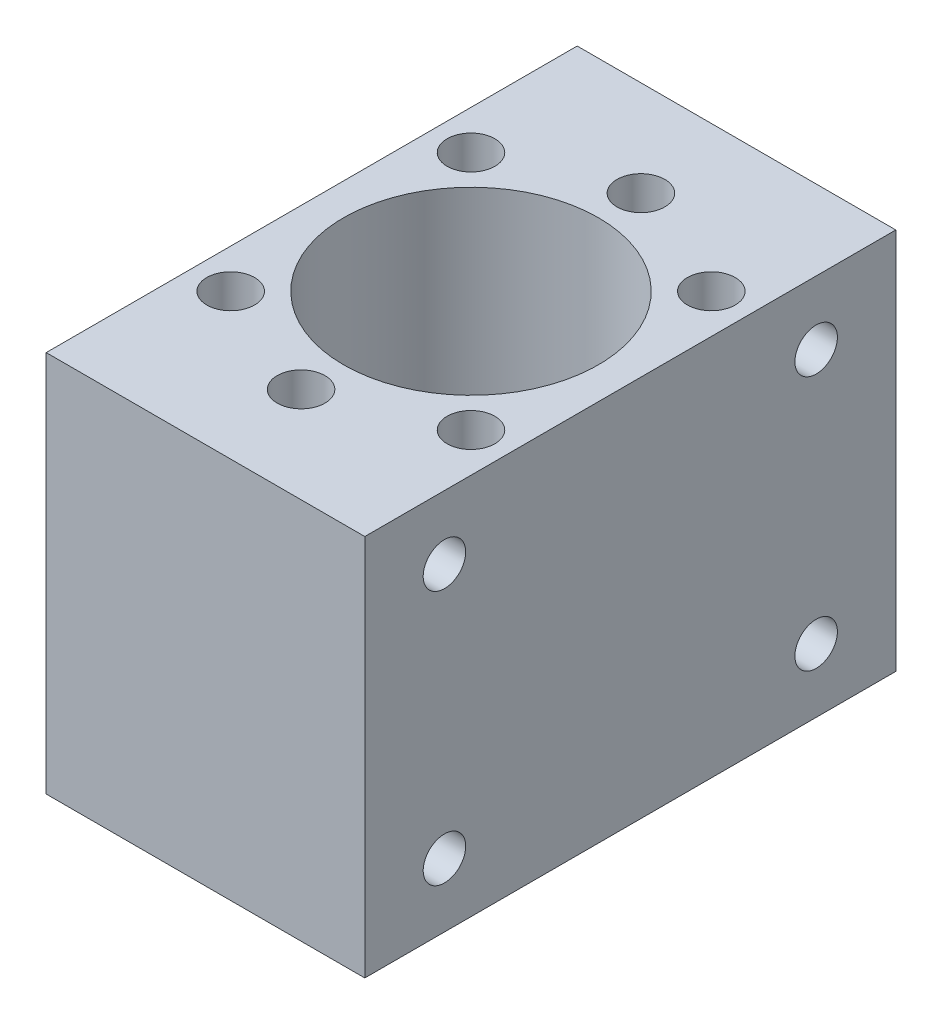
ISO-10303-21;
HEADER;
FILE_DESCRIPTION(('STEP AP214'),'2;1');
FILE_NAME('part.step','',(''),(''),'','','');
FILE_SCHEMA(('AUTOMOTIVE_DESIGN { 1 0 10303 214 1 1 1 1 }'));
ENDSEC;
DATA;
#1=APPLICATION_CONTEXT('core data for automotive mechanical design processes');
#2=APPLICATION_PROTOCOL_DEFINITION('international standard','automotive_design',2000,#1);
#3=PRODUCT_CONTEXT('',#1,'mechanical');
#4=PRODUCT('Part','Part','',(#3));
#5=PRODUCT_RELATED_PRODUCT_CATEGORY('part','',(#4));
#6=PRODUCT_DEFINITION_FORMATION('','',#4);
#7=PRODUCT_DEFINITION_CONTEXT('part definition',#1,'design');
#8=PRODUCT_DEFINITION('design','',#6,#7);
#9=PRODUCT_DEFINITION_SHAPE('','',#8);
#10=(LENGTH_UNIT() NAMED_UNIT(*) SI_UNIT(.MILLI.,.METRE.));
#11=(NAMED_UNIT(*) PLANE_ANGLE_UNIT() SI_UNIT($,.RADIAN.));
#12=(NAMED_UNIT(*) SI_UNIT($,.STERADIAN.) SOLID_ANGLE_UNIT());
#13=UNCERTAINTY_MEASURE_WITH_UNIT(LENGTH_MEASURE(1.E-05),#10,'distance_accuracy_value','');
#14=(GEOMETRIC_REPRESENTATION_CONTEXT(3) GLOBAL_UNCERTAINTY_ASSIGNED_CONTEXT((#13)) GLOBAL_UNIT_ASSIGNED_CONTEXT((#10,
#11,#12)) REPRESENTATION_CONTEXT('',''));
#15=CARTESIAN_POINT('',(0.,0.,0.));
#16=DIRECTION('',(0.,0.,1.));
#17=DIRECTION('',(1.,0.,0.));
#18=AXIS2_PLACEMENT_3D('',#15,#16,#17);
#19=CARTESIAN_POINT('',(-15.,4.,-25.));
#20=DIRECTION('',(0.,0.,-1.));
#21=DIRECTION('',(-1.,0.,0.));
#22=AXIS2_PLACEMENT_3D('',#19,#20,#21);
#23=PLANE('',#22);
#24=DIRECTION('',(-1.,0.,0.));
#25=VECTOR('',#24,1.);
#26=CARTESIAN_POINT('',(-15.,40.,-25.));
#27=LINE('',#26,#25);
#28=CARTESIAN_POINT('',(15.,40.,-25.));
#29=VERTEX_POINT('',#28);
#30=CARTESIAN_POINT('',(-15.,40.,-25.));
#31=VERTEX_POINT('',#30);
#32=EDGE_CURVE('E113',#29,#31,#27,.T.);
#33=ORIENTED_EDGE('',*,*,#32,.F.);
#34=DIRECTION('',(0.,1.,0.));
#35=VECTOR('',#34,1.);
#36=CARTESIAN_POINT('',(15.,4.,-25.));
#37=LINE('',#36,#35);
#38=CARTESIAN_POINT('',(15.,4.,-25.));
#39=VERTEX_POINT('',#38);
#40=EDGE_CURVE('E88',#39,#29,#37,.T.);
#41=ORIENTED_EDGE('',*,*,#40,.F.);
#42=DIRECTION('',(-1.,0.,0.));
#43=VECTOR('',#42,1.);
#44=CARTESIAN_POINT('',(-15.,4.,-25.));
#45=LINE('',#44,#43);
#46=CARTESIAN_POINT('',(-15.,4.,-25.));
#47=VERTEX_POINT('',#46);
#48=EDGE_CURVE('E102',#39,#47,#45,.T.);
#49=ORIENTED_EDGE('',*,*,#48,.T.);
#50=DIRECTION('',(0.,1.,0.));
#51=VECTOR('',#50,1.);
#52=CARTESIAN_POINT('',(-15.,4.,-25.));
#53=LINE('',#52,#51);
#54=EDGE_CURVE('E94',#47,#31,#53,.T.);
#55=ORIENTED_EDGE('',*,*,#54,.T.);
#56=EDGE_LOOP('',(#33,#41,#49,#55));
#57=FACE_BOUND('',#56,.T.);
#58=ADVANCED_FACE('F47',(#57),#23,.T.);
#59=CARTESIAN_POINT('',(-15.,4.,25.));
#60=DIRECTION('',(0.,0.,1.));
#61=DIRECTION('',(1.,0.,0.));
#62=AXIS2_PLACEMENT_3D('',#59,#60,#61);
#63=PLANE('',#62);
#64=DIRECTION('',(1.,0.,0.));
#65=VECTOR('',#64,1.);
#66=CARTESIAN_POINT('',(-15.,40.,25.));
#67=LINE('',#66,#65);
#68=CARTESIAN_POINT('',(-15.,40.,25.));
#69=VERTEX_POINT('',#68);
#70=CARTESIAN_POINT('',(15.,40.,25.));
#71=VERTEX_POINT('',#70);
#72=EDGE_CURVE('E108',#69,#71,#67,.T.);
#73=ORIENTED_EDGE('',*,*,#72,.F.);
#74=DIRECTION('',(0.,1.,0.));
#75=VECTOR('',#74,1.);
#76=CARTESIAN_POINT('',(-15.,4.,25.));
#77=LINE('',#76,#75);
#78=CARTESIAN_POINT('',(-15.,4.,25.));
#79=VERTEX_POINT('',#78);
#80=EDGE_CURVE('E98',#79,#69,#77,.T.);
#81=ORIENTED_EDGE('',*,*,#80,.F.);
#82=DIRECTION('',(1.,0.,0.));
#83=VECTOR('',#82,1.);
#84=CARTESIAN_POINT('',(-15.,4.,25.));
#85=LINE('',#84,#83);
#86=CARTESIAN_POINT('',(15.,4.,25.));
#87=VERTEX_POINT('',#86);
#88=EDGE_CURVE('E104',#79,#87,#85,.T.);
#89=ORIENTED_EDGE('',*,*,#88,.T.);
#90=DIRECTION('',(0.,1.,0.));
#91=VECTOR('',#90,1.);
#92=CARTESIAN_POINT('',(15.,4.,25.));
#93=LINE('',#92,#91);
#94=EDGE_CURVE('E64',#87,#71,#93,.T.);
#95=ORIENTED_EDGE('',*,*,#94,.T.);
#96=EDGE_LOOP('',(#73,#81,#89,#95));
#97=FACE_BOUND('',#96,.T.);
#98=ADVANCED_FACE('F144',(#97),#63,.T.);
#99=CARTESIAN_POINT('',(0.,40.,0.));
#100=DIRECTION('',(0.,1.,0.));
#101=DIRECTION('',(0.,0.,1.));
#102=AXIS2_PLACEMENT_3D('',#99,#100,#101);
#103=PLANE('',#102);
#104=CARTESIAN_POINT('',(0.,40.,0.));
#105=DIRECTION('',(0.,1.,0.));
#106=DIRECTION('',(0.,0.,1.));
#107=AXIS2_PLACEMENT_3D('',#104,#105,#106);
#108=CIRCLE('',#107,12.);
#109=CARTESIAN_POINT('',(0.,40.,12.));
#110=VERTEX_POINT('',#109);
#111=EDGE_CURVE('E170',#110,#110,#108,.T.);
#112=ORIENTED_EDGE('',*,*,#111,.F.);
#113=EDGE_LOOP('',(#112));
#114=FACE_BOUND('',#113,.T.);
#115=CARTESIAN_POINT('',(-11.3137084989848,40.,11.3137084989848));
#116=DIRECTION('',(0.,1.,0.));
#117=DIRECTION('',(0.,0.,1.));
#118=AXIS2_PLACEMENT_3D('',#115,#116,#117);
#119=CIRCLE('',#118,2.25);
#120=CARTESIAN_POINT('',(-11.3137084989848,40.,13.5637084989848));
#121=VERTEX_POINT('',#120);
#122=EDGE_CURVE('E123',#121,#121,#119,.T.);
#123=ORIENTED_EDGE('',*,*,#122,.F.);
#124=EDGE_LOOP('',(#123));
#125=FACE_BOUND('',#124,.T.);
#126=CARTESIAN_POINT('',(11.3137084989848,40.,11.3137084989848));
#127=DIRECTION('',(0.,1.,0.));
#128=DIRECTION('',(0.,0.,1.));
#129=AXIS2_PLACEMENT_3D('',#126,#127,#128);
#130=CIRCLE('',#129,2.25);
#131=CARTESIAN_POINT('',(11.3137084989848,40.,13.5637084989848));
#132=VERTEX_POINT('',#131);
#133=EDGE_CURVE('E129',#132,#132,#130,.T.);
#134=ORIENTED_EDGE('',*,*,#133,.F.);
#135=EDGE_LOOP('',(#134));
#136=FACE_BOUND('',#135,.T.);
#137=CARTESIAN_POINT('',(0.,40.,-16.));
#138=DIRECTION('',(0.,1.,0.));
#139=DIRECTION('',(0.,0.,1.));
#140=AXIS2_PLACEMENT_3D('',#137,#138,#139);
#141=CIRCLE('',#140,2.25);
#142=CARTESIAN_POINT('',(0.,40.,-13.75));
#143=VERTEX_POINT('',#142);
#144=EDGE_CURVE('E135',#143,#143,#141,.T.);
#145=ORIENTED_EDGE('',*,*,#144,.F.);
#146=EDGE_LOOP('',(#145));
#147=FACE_BOUND('',#146,.T.);
#148=DIRECTION('',(0.,0.,-1.));
#149=VECTOR('',#148,1.);
#150=CARTESIAN_POINT('',(15.,40.,13.228756555323));
#151=LINE('',#150,#149);
#152=EDGE_CURVE('E11',#71,#29,#151,.T.);
#153=ORIENTED_EDGE('',*,*,#152,.T.);
#154=ORIENTED_EDGE('',*,*,#32,.T.);
#155=DIRECTION('',(0.,0.,1.));
#156=VECTOR('',#155,1.);
#157=CARTESIAN_POINT('',(-15.,40.,-13.228756555323));
#158=LINE('',#157,#156);
#159=EDGE_CURVE('E56',#31,#69,#158,.T.);
#160=ORIENTED_EDGE('',*,*,#159,.T.);
#161=ORIENTED_EDGE('',*,*,#72,.T.);
#162=EDGE_LOOP('',(#153,#154,#160,#161));
#163=FACE_BOUND('',#162,.T.);
#164=CARTESIAN_POINT('',(11.3137084989848,40.,-11.3137084989848));
#165=DIRECTION('',(0.,1.,0.));
#166=DIRECTION('',(0.,0.,1.));
#167=AXIS2_PLACEMENT_3D('',#164,#165,#166);
#168=CIRCLE('',#167,2.25);
#169=CARTESIAN_POINT('',(11.3137084989848,40.,-9.06370849898476));
#170=VERTEX_POINT('',#169);
#171=EDGE_CURVE('E132',#170,#170,#168,.T.);
#172=ORIENTED_EDGE('',*,*,#171,.F.);
#173=EDGE_LOOP('',(#172));
#174=FACE_BOUND('',#173,.T.);
#175=CARTESIAN_POINT('',(0.,40.,16.));
#176=DIRECTION('',(0.,1.,0.));
#177=DIRECTION('',(0.,0.,1.));
#178=AXIS2_PLACEMENT_3D('',#175,#176,#177);
#179=CIRCLE('',#178,2.25);
#180=CARTESIAN_POINT('',(0.,40.,18.25));
#181=VERTEX_POINT('',#180);
#182=EDGE_CURVE('E126',#181,#181,#179,.T.);
#183=ORIENTED_EDGE('',*,*,#182,.F.);
#184=EDGE_LOOP('',(#183));
#185=FACE_BOUND('',#184,.T.);
#186=CARTESIAN_POINT('',(-11.3137084989848,40.,-11.3137084989848));
#187=DIRECTION('',(0.,1.,0.));
#188=DIRECTION('',(0.,0.,1.));
#189=AXIS2_PLACEMENT_3D('',#186,#187,#188);
#190=CIRCLE('',#189,2.25);
#191=CARTESIAN_POINT('',(-11.3137084989848,40.,-9.06370849898476));
#192=VERTEX_POINT('',#191);
#193=EDGE_CURVE('E118',#192,#192,#190,.T.);
#194=ORIENTED_EDGE('',*,*,#193,.F.);
#195=EDGE_LOOP('',(#194));
#196=FACE_BOUND('',#195,.T.);
#197=ADVANCED_FACE('F142',(#114,#125,#136,#147,#163,#174,#185,#196),#103,.T.);
#198=CARTESIAN_POINT('',(-15.,40.,-13.228756555323));
#199=DIRECTION('',(1.,0.,0.));
#200=DIRECTION('',(0.,0.,-1.));
#201=AXIS2_PLACEMENT_3D('',#198,#199,#200);
#202=PLANE('',#201);
#203=ORIENTED_EDGE('',*,*,#159,.F.);
#204=ORIENTED_EDGE('',*,*,#54,.F.);
#205=DIRECTION('',(0.,0.,1.));
#206=VECTOR('',#205,1.);
#207=CARTESIAN_POINT('',(-15.,4.,-25.));
#208=LINE('',#207,#206);
#209=EDGE_CURVE('E96',#47,#79,#208,.T.);
#210=ORIENTED_EDGE('',*,*,#209,.T.);
#211=ORIENTED_EDGE('',*,*,#80,.T.);
#212=EDGE_LOOP('',(#203,#204,#210,#211));
#213=FACE_BOUND('',#212,.T.);
#214=ADVANCED_FACE('F49',(#213),#202,.F.);
#215=CARTESIAN_POINT('',(15.,40.,13.228756555323));
#216=DIRECTION('',(-1.,0.,0.));
#217=DIRECTION('',(0.,0.,1.));
#218=AXIS2_PLACEMENT_3D('',#215,#216,#217);
#219=PLANE('',#218);
#220=CARTESIAN_POINT('',(15.,10.,-17.5));
#221=DIRECTION('',(1.,0.,0.));
#222=DIRECTION('',(0.,0.,-1.));
#223=AXIS2_PLACEMENT_3D('',#220,#221,#222);
#224=CIRCLE('',#223,2.);
#225=CARTESIAN_POINT('',(15.,10.,-19.5));
#226=VERTEX_POINT('',#225);
#227=EDGE_CURVE('E265',#226,#226,#224,.T.);
#228=ORIENTED_EDGE('',*,*,#227,.F.);
#229=EDGE_LOOP('',(#228));
#230=FACE_BOUND('',#229,.T.);
#231=CARTESIAN_POINT('',(15.,10.,17.5));
#232=DIRECTION('',(1.,0.,0.));
#233=DIRECTION('',(0.,0.,-1.));
#234=AXIS2_PLACEMENT_3D('',#231,#232,#233);
#235=CIRCLE('',#234,2.);
#236=CARTESIAN_POINT('',(15.,10.,15.5));
#237=VERTEX_POINT('',#236);
#238=EDGE_CURVE('E257',#237,#237,#235,.T.);
#239=ORIENTED_EDGE('',*,*,#238,.F.);
#240=EDGE_LOOP('',(#239));
#241=FACE_BOUND('',#240,.T.);
#242=CARTESIAN_POINT('',(15.,34.,17.5));
#243=DIRECTION('',(1.,0.,0.));
#244=DIRECTION('',(0.,0.,-1.));
#245=AXIS2_PLACEMENT_3D('',#242,#243,#244);
#246=CIRCLE('',#245,2.);
#247=CARTESIAN_POINT('',(15.,34.,15.5));
#248=VERTEX_POINT('',#247);
#249=EDGE_CURVE('E250',#248,#248,#246,.T.);
#250=ORIENTED_EDGE('',*,*,#249,.F.);
#251=EDGE_LOOP('',(#250));
#252=FACE_BOUND('',#251,.T.);
#253=CARTESIAN_POINT('',(15.,34.,-17.5));
#254=DIRECTION('',(1.,0.,0.));
#255=DIRECTION('',(0.,0.,-1.));
#256=AXIS2_PLACEMENT_3D('',#253,#254,#255);
#257=CIRCLE('',#256,2.);
#258=CARTESIAN_POINT('',(15.,34.,-19.5));
#259=VERTEX_POINT('',#258);
#260=EDGE_CURVE('E252',#259,#259,#257,.T.);
#261=ORIENTED_EDGE('',*,*,#260,.F.);
#262=EDGE_LOOP('',(#261));
#263=FACE_BOUND('',#262,.T.);
#264=ORIENTED_EDGE('',*,*,#40,.T.);
#265=ORIENTED_EDGE('',*,*,#152,.F.);
#266=ORIENTED_EDGE('',*,*,#94,.F.);
#267=DIRECTION('',(0.,0.,-1.));
#268=VECTOR('',#267,1.);
#269=CARTESIAN_POINT('',(15.,4.,-25.));
#270=LINE('',#269,#268);
#271=EDGE_CURVE('E106',#87,#39,#270,.T.);
#272=ORIENTED_EDGE('',*,*,#271,.T.);
#273=EDGE_LOOP('',(#264,#265,#266,#272));
#274=FACE_BOUND('',#273,.T.);
#275=ADVANCED_FACE('F157',(#230,#241,#252,#263,#274),#219,.F.);
#276=CARTESIAN_POINT('',(-11.3137084989848,40.,-11.3137084989848));
#277=DIRECTION('',(0.,-1.,0.));
#278=DIRECTION('',(0.,0.,-1.));
#279=AXIS2_PLACEMENT_3D('',#276,#277,#278);
#280=CYLINDRICAL_SURFACE('',#279,2.25);
#281=ORIENTED_EDGE('',*,*,#193,.T.);
#282=EDGE_LOOP('',(#281));
#283=FACE_BOUND('',#282,.T.);
#284=CARTESIAN_POINT('',(-11.3137084989848,4.,-11.3137084989848));
#285=DIRECTION('',(0.,1.,0.));
#286=DIRECTION('',(0.,0.,1.));
#287=AXIS2_PLACEMENT_3D('',#284,#285,#286);
#288=CIRCLE('',#287,2.25);
#289=CARTESIAN_POINT('',(-11.3137084989848,4.,-9.06370849898476));
#290=VERTEX_POINT('',#289);
#291=EDGE_CURVE('E161',#290,#290,#288,.T.);
#292=ORIENTED_EDGE('',*,*,#291,.F.);
#293=EDGE_LOOP('',(#292));
#294=FACE_BOUND('',#293,.T.);
#295=ADVANCED_FACE('F154',(#283,#294),#280,.F.);
#296=CARTESIAN_POINT('',(0.,40.,-16.));
#297=DIRECTION('',(0.,-1.,0.));
#298=DIRECTION('',(0.,0.,-1.));
#299=AXIS2_PLACEMENT_3D('',#296,#297,#298);
#300=CYLINDRICAL_SURFACE('',#299,2.25);
#301=ORIENTED_EDGE('',*,*,#144,.T.);
#302=EDGE_LOOP('',(#301));
#303=FACE_BOUND('',#302,.T.);
#304=CARTESIAN_POINT('',(0.,4.,-16.));
#305=DIRECTION('',(0.,1.,0.));
#306=DIRECTION('',(0.,0.,1.));
#307=AXIS2_PLACEMENT_3D('',#304,#305,#306);
#308=CIRCLE('',#307,2.25);
#309=CARTESIAN_POINT('',(0.,4.,-13.75));
#310=VERTEX_POINT('',#309);
#311=EDGE_CURVE('E163',#310,#310,#308,.T.);
#312=ORIENTED_EDGE('',*,*,#311,.F.);
#313=EDGE_LOOP('',(#312));
#314=FACE_BOUND('',#313,.T.);
#315=ADVANCED_FACE('F139',(#303,#314),#300,.F.);
#316=CARTESIAN_POINT('',(11.3137084989848,40.,-11.3137084989848));
#317=DIRECTION('',(0.,-1.,0.));
#318=DIRECTION('',(0.,0.,-1.));
#319=AXIS2_PLACEMENT_3D('',#316,#317,#318);
#320=CYLINDRICAL_SURFACE('',#319,2.25);
#321=ORIENTED_EDGE('',*,*,#171,.T.);
#322=EDGE_LOOP('',(#321));
#323=FACE_BOUND('',#322,.T.);
#324=CARTESIAN_POINT('',(11.3137084989848,4.,-11.3137084989848));
#325=DIRECTION('',(0.,1.,0.));
#326=DIRECTION('',(0.,0.,1.));
#327=AXIS2_PLACEMENT_3D('',#324,#325,#326);
#328=CIRCLE('',#327,2.25);
#329=CARTESIAN_POINT('',(11.3137084989848,4.,-9.06370849898476));
#330=VERTEX_POINT('',#329);
#331=EDGE_CURVE('E167',#330,#330,#328,.T.);
#332=ORIENTED_EDGE('',*,*,#331,.F.);
#333=EDGE_LOOP('',(#332));
#334=FACE_BOUND('',#333,.T.);
#335=ADVANCED_FACE('F283',(#323,#334),#320,.F.);
#336=CARTESIAN_POINT('',(11.3137084989848,40.,11.3137084989848));
#337=DIRECTION('',(0.,-1.,0.));
#338=DIRECTION('',(0.,0.,-1.));
#339=AXIS2_PLACEMENT_3D('',#336,#337,#338);
#340=CYLINDRICAL_SURFACE('',#339,2.25);
#341=ORIENTED_EDGE('',*,*,#133,.T.);
#342=EDGE_LOOP('',(#341));
#343=FACE_BOUND('',#342,.T.);
#344=CARTESIAN_POINT('',(11.3137084989848,4.,11.3137084989848));
#345=DIRECTION('',(0.,1.,0.));
#346=DIRECTION('',(0.,0.,1.));
#347=AXIS2_PLACEMENT_3D('',#344,#345,#346);
#348=CIRCLE('',#347,2.25);
#349=CARTESIAN_POINT('',(11.3137084989848,4.,13.5637084989848));
#350=VERTEX_POINT('',#349);
#351=EDGE_CURVE('E176',#350,#350,#348,.T.);
#352=ORIENTED_EDGE('',*,*,#351,.F.);
#353=EDGE_LOOP('',(#352));
#354=FACE_BOUND('',#353,.T.);
#355=ADVANCED_FACE('F197',(#343,#354),#340,.F.);
#356=CARTESIAN_POINT('',(0.,40.,16.));
#357=DIRECTION('',(0.,-1.,0.));
#358=DIRECTION('',(0.,0.,-1.));
#359=AXIS2_PLACEMENT_3D('',#356,#357,#358);
#360=CYLINDRICAL_SURFACE('',#359,2.25);
#361=ORIENTED_EDGE('',*,*,#182,.T.);
#362=EDGE_LOOP('',(#361));
#363=FACE_BOUND('',#362,.T.);
#364=CARTESIAN_POINT('',(0.,4.,16.));
#365=DIRECTION('',(0.,1.,0.));
#366=DIRECTION('',(0.,0.,1.));
#367=AXIS2_PLACEMENT_3D('',#364,#365,#366);
#368=CIRCLE('',#367,2.25);
#369=CARTESIAN_POINT('',(0.,4.,18.25));
#370=VERTEX_POINT('',#369);
#371=EDGE_CURVE('E179',#370,#370,#368,.T.);
#372=ORIENTED_EDGE('',*,*,#371,.F.);
#373=EDGE_LOOP('',(#372));
#374=FACE_BOUND('',#373,.T.);
#375=ADVANCED_FACE('F187',(#363,#374),#360,.F.);
#376=CARTESIAN_POINT('',(-11.3137084989848,40.,11.3137084989848));
#377=DIRECTION('',(0.,-1.,0.));
#378=DIRECTION('',(0.,0.,-1.));
#379=AXIS2_PLACEMENT_3D('',#376,#377,#378);
#380=CYLINDRICAL_SURFACE('',#379,2.25);
#381=ORIENTED_EDGE('',*,*,#122,.T.);
#382=EDGE_LOOP('',(#381));
#383=FACE_BOUND('',#382,.T.);
#384=CARTESIAN_POINT('',(-11.3137084989848,4.,11.3137084989848));
#385=DIRECTION('',(0.,1.,0.));
#386=DIRECTION('',(0.,0.,1.));
#387=AXIS2_PLACEMENT_3D('',#384,#385,#386);
#388=CIRCLE('',#387,2.25);
#389=CARTESIAN_POINT('',(-11.3137084989848,4.,13.5637084989848));
#390=VERTEX_POINT('',#389);
#391=EDGE_CURVE('E115',#390,#390,#388,.T.);
#392=ORIENTED_EDGE('',*,*,#391,.F.);
#393=EDGE_LOOP('',(#392));
#394=FACE_BOUND('',#393,.T.);
#395=ADVANCED_FACE('F185',(#383,#394),#380,.F.);
#396=CARTESIAN_POINT('',(0.,4.,0.));
#397=DIRECTION('',(0.,1.,0.));
#398=DIRECTION('',(0.,0.,1.));
#399=AXIS2_PLACEMENT_3D('',#396,#397,#398);
#400=PLANE('',#399);
#401=CARTESIAN_POINT('',(0.,4.,0.));
#402=DIRECTION('',(0.,1.,0.));
#403=DIRECTION('',(0.,0.,1.));
#404=AXIS2_PLACEMENT_3D('',#401,#402,#403);
#405=CIRCLE('',#404,12.);
#406=CARTESIAN_POINT('',(0.,4.,12.));
#407=VERTEX_POINT('',#406);
#408=EDGE_CURVE('E164',#407,#407,#405,.T.);
#409=ORIENTED_EDGE('',*,*,#408,.T.);
#410=EDGE_LOOP('',(#409));
#411=FACE_BOUND('',#410,.T.);
#412=ORIENTED_EDGE('',*,*,#291,.T.);
#413=EDGE_LOOP('',(#412));
#414=FACE_BOUND('',#413,.T.);
#415=ORIENTED_EDGE('',*,*,#311,.T.);
#416=EDGE_LOOP('',(#415));
#417=FACE_BOUND('',#416,.T.);
#418=ORIENTED_EDGE('',*,*,#331,.T.);
#419=EDGE_LOOP('',(#418));
#420=FACE_BOUND('',#419,.T.);
#421=ORIENTED_EDGE('',*,*,#351,.T.);
#422=EDGE_LOOP('',(#421));
#423=FACE_BOUND('',#422,.T.);
#424=ORIENTED_EDGE('',*,*,#371,.T.);
#425=EDGE_LOOP('',(#424));
#426=FACE_BOUND('',#425,.T.);
#427=ORIENTED_EDGE('',*,*,#391,.T.);
#428=EDGE_LOOP('',(#427));
#429=FACE_BOUND('',#428,.T.);
#430=ORIENTED_EDGE('',*,*,#271,.F.);
#431=ORIENTED_EDGE('',*,*,#88,.F.);
#432=ORIENTED_EDGE('',*,*,#209,.F.);
#433=ORIENTED_EDGE('',*,*,#48,.F.);
#434=EDGE_LOOP('',(#430,#431,#432,#433));
#435=FACE_BOUND('',#434,.T.);
#436=ADVANCED_FACE('F101',(#411,#414,#417,#420,#423,#426,#429,#435),#400,.F.);
#437=CARTESIAN_POINT('',(0.,4.,0.));
#438=DIRECTION('',(0.,1.,0.));
#439=DIRECTION('',(0.,0.,1.));
#440=AXIS2_PLACEMENT_3D('',#437,#438,#439);
#441=CYLINDRICAL_SURFACE('',#440,12.);
#442=ORIENTED_EDGE('',*,*,#408,.F.);
#443=EDGE_LOOP('',(#442));
#444=FACE_BOUND('',#443,.T.);
#445=ORIENTED_EDGE('',*,*,#111,.T.);
#446=EDGE_LOOP('',(#445));
#447=FACE_BOUND('',#446,.T.);
#448=ADVANCED_FACE('F194',(#444,#447),#441,.F.);
#449=CARTESIAN_POINT('',(5.,34.,-17.5));
#450=DIRECTION('',(1.,0.,0.));
#451=DIRECTION('',(0.,0.,-1.));
#452=AXIS2_PLACEMENT_3D('',#449,#450,#451);
#453=CYLINDRICAL_SURFACE('',#452,2.);
#454=CARTESIAN_POINT('',(5.,34.,-17.5));
#455=DIRECTION('',(1.,0.,0.));
#456=DIRECTION('',(0.,0.,-1.));
#457=AXIS2_PLACEMENT_3D('',#454,#455,#456);
#458=CIRCLE('',#457,2.);
#459=CARTESIAN_POINT('',(5.,34.,-19.5));
#460=VERTEX_POINT('',#459);
#461=EDGE_CURVE('E255',#460,#460,#458,.T.);
#462=ORIENTED_EDGE('',*,*,#461,.F.);
#463=EDGE_LOOP('',(#462));
#464=FACE_BOUND('',#463,.T.);
#465=ORIENTED_EDGE('',*,*,#260,.T.);
#466=EDGE_LOOP('',(#465));
#467=FACE_BOUND('',#466,.T.);
#468=ADVANCED_FACE('F210',(#464,#467),#453,.F.);
#469=CARTESIAN_POINT('',(5.,34.,-17.5));
#470=DIRECTION('',(1.,0.,0.));
#471=DIRECTION('',(0.,0.,-1.));
#472=AXIS2_PLACEMENT_3D('',#469,#470,#471);
#473=PLANE('',#472);
#474=ORIENTED_EDGE('',*,*,#461,.T.);
#475=EDGE_LOOP('',(#474));
#476=FACE_BOUND('',#475,.T.);
#477=ADVANCED_FACE('F214',(#476),#473,.T.);
#478=CARTESIAN_POINT('',(5.,34.,17.5));
#479=DIRECTION('',(1.,0.,0.));
#480=DIRECTION('',(0.,0.,-1.));
#481=AXIS2_PLACEMENT_3D('',#478,#479,#480);
#482=CYLINDRICAL_SURFACE('',#481,2.);
#483=CARTESIAN_POINT('',(5.,34.,17.5));
#484=DIRECTION('',(1.,0.,0.));
#485=DIRECTION('',(0.,0.,-1.));
#486=AXIS2_PLACEMENT_3D('',#483,#484,#485);
#487=CIRCLE('',#486,2.);
#488=CARTESIAN_POINT('',(5.,34.,15.5));
#489=VERTEX_POINT('',#488);
#490=EDGE_CURVE('E247',#489,#489,#487,.T.);
#491=ORIENTED_EDGE('',*,*,#490,.F.);
#492=EDGE_LOOP('',(#491));
#493=FACE_BOUND('',#492,.T.);
#494=ORIENTED_EDGE('',*,*,#249,.T.);
#495=EDGE_LOOP('',(#494));
#496=FACE_BOUND('',#495,.T.);
#497=ADVANCED_FACE('F218',(#493,#496),#482,.F.);
#498=CARTESIAN_POINT('',(5.,34.,17.5));
#499=DIRECTION('',(1.,0.,0.));
#500=DIRECTION('',(0.,0.,-1.));
#501=AXIS2_PLACEMENT_3D('',#498,#499,#500);
#502=PLANE('',#501);
#503=ORIENTED_EDGE('',*,*,#490,.T.);
#504=EDGE_LOOP('',(#503));
#505=FACE_BOUND('',#504,.T.);
#506=ADVANCED_FACE('F235',(#505),#502,.T.);
#507=CARTESIAN_POINT('',(5.,10.,17.5));
#508=DIRECTION('',(1.,0.,0.));
#509=DIRECTION('',(0.,0.,-1.));
#510=AXIS2_PLACEMENT_3D('',#507,#508,#509);
#511=CYLINDRICAL_SURFACE('',#510,2.);
#512=CARTESIAN_POINT('',(5.,10.,17.5));
#513=DIRECTION('',(1.,0.,0.));
#514=DIRECTION('',(0.,0.,-1.));
#515=AXIS2_PLACEMENT_3D('',#512,#513,#514);
#516=CIRCLE('',#515,2.);
#517=CARTESIAN_POINT('',(5.,10.,15.5));
#518=VERTEX_POINT('',#517);
#519=EDGE_CURVE('E262',#518,#518,#516,.T.);
#520=ORIENTED_EDGE('',*,*,#519,.F.);
#521=EDGE_LOOP('',(#520));
#522=FACE_BOUND('',#521,.T.);
#523=ORIENTED_EDGE('',*,*,#238,.T.);
#524=EDGE_LOOP('',(#523));
#525=FACE_BOUND('',#524,.T.);
#526=ADVANCED_FACE('F231',(#522,#525),#511,.F.);
#527=CARTESIAN_POINT('',(5.,10.,17.5));
#528=DIRECTION('',(1.,0.,0.));
#529=DIRECTION('',(0.,0.,-1.));
#530=AXIS2_PLACEMENT_3D('',#527,#528,#529);
#531=PLANE('',#530);
#532=ORIENTED_EDGE('',*,*,#519,.T.);
#533=EDGE_LOOP('',(#532));
#534=FACE_BOUND('',#533,.T.);
#535=ADVANCED_FACE('F227',(#534),#531,.T.);
#536=CARTESIAN_POINT('',(5.,10.,-17.5));
#537=DIRECTION('',(1.,0.,0.));
#538=DIRECTION('',(0.,0.,-1.));
#539=AXIS2_PLACEMENT_3D('',#536,#537,#538);
#540=CYLINDRICAL_SURFACE('',#539,2.);
#541=CARTESIAN_POINT('',(5.,10.,-17.5));
#542=DIRECTION('',(1.,0.,0.));
#543=DIRECTION('',(0.,0.,-1.));
#544=AXIS2_PLACEMENT_3D('',#541,#542,#543);
#545=CIRCLE('',#544,2.);
#546=CARTESIAN_POINT('',(5.,10.,-19.5));
#547=VERTEX_POINT('',#546);
#548=EDGE_CURVE('E268',#547,#547,#545,.T.);
#549=ORIENTED_EDGE('',*,*,#548,.F.);
#550=EDGE_LOOP('',(#549));
#551=FACE_BOUND('',#550,.T.);
#552=ORIENTED_EDGE('',*,*,#227,.T.);
#553=EDGE_LOOP('',(#552));
#554=FACE_BOUND('',#553,.T.);
#555=ADVANCED_FACE('F223',(#551,#554),#540,.F.);
#556=CARTESIAN_POINT('',(5.,10.,-17.5));
#557=DIRECTION('',(1.,0.,0.));
#558=DIRECTION('',(0.,0.,-1.));
#559=AXIS2_PLACEMENT_3D('',#556,#557,#558);
#560=PLANE('',#559);
#561=ORIENTED_EDGE('',*,*,#548,.T.);
#562=EDGE_LOOP('',(#561));
#563=FACE_BOUND('',#562,.T.);
#564=ADVANCED_FACE('F220',(#563),#560,.T.);
#565=CLOSED_SHELL('',(#58,#98,#197,#214,#275,#295,#315,#335,#355,#375,#395,#436,#448,#468,#477,
#497,#506,#526,#535,#555,#564));
#566=MANIFOLD_SOLID_BREP('B2',#565);
#567=ADVANCED_BREP_SHAPE_REPRESENTATION('',(#18,#566),#14);
#568=SHAPE_DEFINITION_REPRESENTATION(#9,#567);
ENDSEC;
END-ISO-10303-21;
